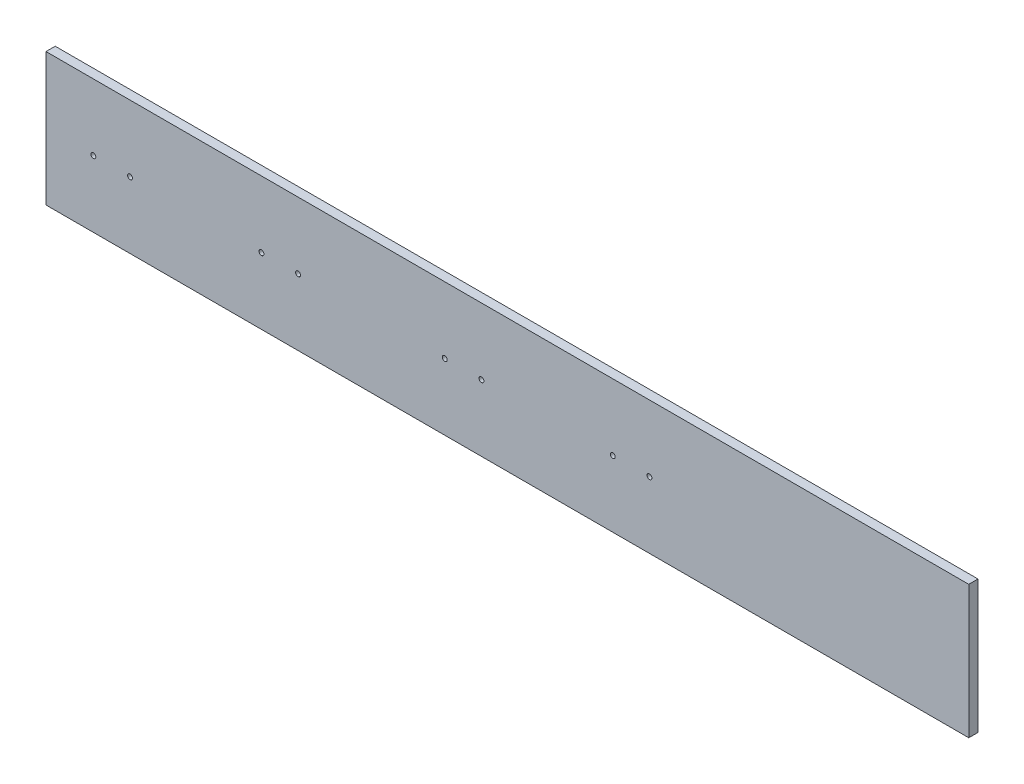
ISO-10303-21;
HEADER;
FILE_DESCRIPTION(('STEP AP214'),'2;1');
FILE_NAME('part.step','',(''),(''),'','','');
FILE_SCHEMA(('AUTOMOTIVE_DESIGN { 1 0 10303 214 1 1 1 1 }'));
ENDSEC;
DATA;
#1=APPLICATION_CONTEXT('core data for automotive mechanical design processes');
#2=APPLICATION_PROTOCOL_DEFINITION('international standard','automotive_design',2000,#1);
#3=PRODUCT_CONTEXT('',#1,'mechanical');
#4=PRODUCT('Part','Part','',(#3));
#5=PRODUCT_RELATED_PRODUCT_CATEGORY('part','',(#4));
#6=PRODUCT_DEFINITION_FORMATION('','',#4);
#7=PRODUCT_DEFINITION_CONTEXT('part definition',#1,'design');
#8=PRODUCT_DEFINITION('design','',#6,#7);
#9=PRODUCT_DEFINITION_SHAPE('','',#8);
#10=(LENGTH_UNIT() NAMED_UNIT(*) SI_UNIT(.MILLI.,.METRE.));
#11=(NAMED_UNIT(*) PLANE_ANGLE_UNIT() SI_UNIT($,.RADIAN.));
#12=(NAMED_UNIT(*) SI_UNIT($,.STERADIAN.) SOLID_ANGLE_UNIT());
#13=UNCERTAINTY_MEASURE_WITH_UNIT(LENGTH_MEASURE(1.E-05),#10,'distance_accuracy_value','');
#14=(GEOMETRIC_REPRESENTATION_CONTEXT(3) GLOBAL_UNCERTAINTY_ASSIGNED_CONTEXT((#13)) GLOBAL_UNIT_ASSIGNED_CONTEXT((#10,
#11,#12)) REPRESENTATION_CONTEXT('',''));
#15=CARTESIAN_POINT('',(0.,0.,0.));
#16=DIRECTION('',(0.,0.,1.));
#17=DIRECTION('',(1.,0.,0.));
#18=AXIS2_PLACEMENT_3D('',#15,#16,#17);
#19=CARTESIAN_POINT('',(126.125,-127.375,-0.046));
#20=DIRECTION('',(0.,0.,-1.));
#21=DIRECTION('',(0.,-1.,0.));
#22=AXIS2_PLACEMENT_3D('',#19,#20,#21);
#23=CYLINDRICAL_SURFACE('',#22,0.4);
#24=CARTESIAN_POINT('',(126.125,-127.375,0.));
#25=DIRECTION('',(0.,0.,-1.));
#26=DIRECTION('',(0.,-1.,0.));
#27=AXIS2_PLACEMENT_3D('',#24,#25,#26);
#28=CIRCLE('',#27,0.4);
#29=CARTESIAN_POINT('',(126.125,-127.775,0.));
#30=VERTEX_POINT('',#29);
#31=EDGE_CURVE('E226',#30,#30,#28,.T.);
#32=ORIENTED_EDGE('',*,*,#31,.T.);
#33=DIRECTION('',(0.,0.,1.));
#34=VECTOR('',#33,1.);
#35=CARTESIAN_POINT('',(126.125,-127.775,-0.046));
#36=LINE('',#35,#34);
#37=CARTESIAN_POINT('',(126.125,-127.775,1.51));
#38=VERTEX_POINT('',#37);
#39=EDGE_CURVE('E10',#30,#38,#36,.T.);
#40=ORIENTED_EDGE('',*,*,#39,.T.);
#41=CARTESIAN_POINT('',(126.125,-127.375,1.51));
#42=DIRECTION('',(0.,0.,-1.));
#43=DIRECTION('',(0.,-1.,0.));
#44=AXIS2_PLACEMENT_3D('',#41,#42,#43);
#45=CIRCLE('',#44,0.4);
#46=EDGE_CURVE('E258',#38,#38,#45,.T.);
#47=ORIENTED_EDGE('',*,*,#46,.F.);
#48=ORIENTED_EDGE('',*,*,#39,.F.);
#49=EDGE_LOOP('',(#32,#40,#47,#48));
#50=FACE_BOUND('',#49,.T.);
#51=ADVANCED_FACE('F16',(#50),#23,.F.);
#52=CARTESIAN_POINT('',(120.125,-127.375,-0.046));
#53=DIRECTION('',(0.,0.,-1.));
#54=DIRECTION('',(0.,-1.,0.));
#55=AXIS2_PLACEMENT_3D('',#52,#53,#54);
#56=CYLINDRICAL_SURFACE('',#55,0.4);
#57=CARTESIAN_POINT('',(120.125,-127.375,0.));
#58=DIRECTION('',(0.,0.,-1.));
#59=DIRECTION('',(0.,-1.,0.));
#60=AXIS2_PLACEMENT_3D('',#57,#58,#59);
#61=CIRCLE('',#60,0.4);
#62=CARTESIAN_POINT('',(120.125,-127.775,0.));
#63=VERTEX_POINT('',#62);
#64=EDGE_CURVE('E219',#63,#63,#61,.T.);
#65=ORIENTED_EDGE('',*,*,#64,.T.);
#66=DIRECTION('',(0.,0.,1.));
#67=VECTOR('',#66,1.);
#68=CARTESIAN_POINT('',(120.125,-127.775,-0.046));
#69=LINE('',#68,#67);
#70=CARTESIAN_POINT('',(120.125,-127.775,1.51));
#71=VERTEX_POINT('',#70);
#72=EDGE_CURVE('E24',#63,#71,#69,.T.);
#73=ORIENTED_EDGE('',*,*,#72,.T.);
#74=CARTESIAN_POINT('',(120.125,-127.375,1.51));
#75=DIRECTION('',(0.,0.,-1.));
#76=DIRECTION('',(0.,-1.,0.));
#77=AXIS2_PLACEMENT_3D('',#74,#75,#76);
#78=CIRCLE('',#77,0.4);
#79=EDGE_CURVE('E255',#71,#71,#78,.T.);
#80=ORIENTED_EDGE('',*,*,#79,.F.);
#81=ORIENTED_EDGE('',*,*,#72,.F.);
#82=EDGE_LOOP('',(#65,#73,#80,#81));
#83=FACE_BOUND('',#82,.T.);
#84=ADVANCED_FACE('F503',(#83),#56,.F.);
#85=CARTESIAN_POINT('',(96.125,-127.375,-0.046));
#86=DIRECTION('',(0.,0.,-1.));
#87=DIRECTION('',(0.,-1.,0.));
#88=AXIS2_PLACEMENT_3D('',#85,#86,#87);
#89=CYLINDRICAL_SURFACE('',#88,0.4);
#90=CARTESIAN_POINT('',(96.125,-127.375,0.));
#91=DIRECTION('',(0.,0.,-1.));
#92=DIRECTION('',(0.,-1.,0.));
#93=AXIS2_PLACEMENT_3D('',#90,#91,#92);
#94=CIRCLE('',#93,0.4);
#95=CARTESIAN_POINT('',(96.125,-127.775,0.));
#96=VERTEX_POINT('',#95);
#97=EDGE_CURVE('E215',#96,#96,#94,.T.);
#98=ORIENTED_EDGE('',*,*,#97,.T.);
#99=DIRECTION('',(0.,0.,1.));
#100=VECTOR('',#99,1.);
#101=CARTESIAN_POINT('',(96.125,-127.775,-0.046));
#102=LINE('',#101,#100);
#103=CARTESIAN_POINT('',(96.125,-127.775,1.51));
#104=VERTEX_POINT('',#103);
#105=EDGE_CURVE('E220',#96,#104,#102,.T.);
#106=ORIENTED_EDGE('',*,*,#105,.T.);
#107=CARTESIAN_POINT('',(96.125,-127.375,1.51));
#108=DIRECTION('',(0.,0.,-1.));
#109=DIRECTION('',(0.,-1.,0.));
#110=AXIS2_PLACEMENT_3D('',#107,#108,#109);
#111=CIRCLE('',#110,0.4);
#112=EDGE_CURVE('E251',#104,#104,#111,.T.);
#113=ORIENTED_EDGE('',*,*,#112,.F.);
#114=ORIENTED_EDGE('',*,*,#105,.F.);
#115=EDGE_LOOP('',(#98,#106,#113,#114));
#116=FACE_BOUND('',#115,.T.);
#117=ADVANCED_FACE('F492',(#116),#89,.F.);
#118=CARTESIAN_POINT('',(90.125,-127.375,-0.046));
#119=DIRECTION('',(0.,0.,-1.));
#120=DIRECTION('',(0.,-1.,0.));
#121=AXIS2_PLACEMENT_3D('',#118,#119,#120);
#122=CYLINDRICAL_SURFACE('',#121,0.4);
#123=CARTESIAN_POINT('',(90.125,-127.375,0.));
#124=DIRECTION('',(0.,0.,-1.));
#125=DIRECTION('',(0.,-1.,0.));
#126=AXIS2_PLACEMENT_3D('',#123,#124,#125);
#127=CIRCLE('',#126,0.4);
#128=CARTESIAN_POINT('',(90.125,-127.775,0.));
#129=VERTEX_POINT('',#128);
#130=EDGE_CURVE('E194',#129,#129,#127,.T.);
#131=ORIENTED_EDGE('',*,*,#130,.T.);
#132=DIRECTION('',(0.,0.,1.));
#133=VECTOR('',#132,1.);
#134=CARTESIAN_POINT('',(90.125,-127.775,-0.046));
#135=LINE('',#134,#133);
#136=CARTESIAN_POINT('',(90.125,-127.775,1.51));
#137=VERTEX_POINT('',#136);
#138=EDGE_CURVE('E223',#129,#137,#135,.T.);
#139=ORIENTED_EDGE('',*,*,#138,.T.);
#140=CARTESIAN_POINT('',(90.125,-127.375,1.51));
#141=DIRECTION('',(0.,0.,-1.));
#142=DIRECTION('',(0.,-1.,0.));
#143=AXIS2_PLACEMENT_3D('',#140,#141,#142);
#144=CIRCLE('',#143,0.4);
#145=EDGE_CURVE('E247',#137,#137,#144,.T.);
#146=ORIENTED_EDGE('',*,*,#145,.F.);
#147=ORIENTED_EDGE('',*,*,#138,.F.);
#148=EDGE_LOOP('',(#131,#139,#146,#147));
#149=FACE_BOUND('',#148,.T.);
#150=ADVANCED_FACE('F482',(#149),#122,.F.);
#151=CARTESIAN_POINT('',(68.625,-127.375,-0.046));
#152=DIRECTION('',(0.,0.,-1.));
#153=DIRECTION('',(0.,-1.,0.));
#154=AXIS2_PLACEMENT_3D('',#151,#152,#153);
#155=CYLINDRICAL_SURFACE('',#154,0.4);
#156=CARTESIAN_POINT('',(68.625,-127.375,0.));
#157=DIRECTION('',(0.,0.,-1.));
#158=DIRECTION('',(0.,-1.,0.));
#159=AXIS2_PLACEMENT_3D('',#156,#157,#158);
#160=CIRCLE('',#159,0.4);
#161=CARTESIAN_POINT('',(68.625,-127.775,0.));
#162=VERTEX_POINT('',#161);
#163=EDGE_CURVE('E190',#162,#162,#160,.T.);
#164=ORIENTED_EDGE('',*,*,#163,.T.);
#165=DIRECTION('',(0.,0.,1.));
#166=VECTOR('',#165,1.);
#167=CARTESIAN_POINT('',(68.625,-127.775,-0.046));
#168=LINE('',#167,#166);
#169=CARTESIAN_POINT('',(68.625,-127.775,1.51));
#170=VERTEX_POINT('',#169);
#171=EDGE_CURVE('E239',#162,#170,#168,.T.);
#172=ORIENTED_EDGE('',*,*,#171,.T.);
#173=CARTESIAN_POINT('',(68.625,-127.375,1.51));
#174=DIRECTION('',(0.,0.,-1.));
#175=DIRECTION('',(0.,-1.,0.));
#176=AXIS2_PLACEMENT_3D('',#173,#174,#175);
#177=CIRCLE('',#176,0.4);
#178=EDGE_CURVE('E210',#170,#170,#177,.T.);
#179=ORIENTED_EDGE('',*,*,#178,.F.);
#180=ORIENTED_EDGE('',*,*,#171,.F.);
#181=EDGE_LOOP('',(#164,#172,#179,#180));
#182=FACE_BOUND('',#181,.T.);
#183=ADVANCED_FACE('F471',(#182),#155,.F.);
#184=CARTESIAN_POINT('',(62.625,-127.375,-0.046));
#185=DIRECTION('',(0.,0.,-1.));
#186=DIRECTION('',(0.,-1.,0.));
#187=AXIS2_PLACEMENT_3D('',#184,#185,#186);
#188=CYLINDRICAL_SURFACE('',#187,0.4);
#189=CARTESIAN_POINT('',(62.625,-127.375,0.));
#190=DIRECTION('',(0.,0.,-1.));
#191=DIRECTION('',(0.,-1.,0.));
#192=AXIS2_PLACEMENT_3D('',#189,#190,#191);
#193=CIRCLE('',#192,0.4);
#194=CARTESIAN_POINT('',(62.625,-127.775,0.));
#195=VERTEX_POINT('',#194);
#196=EDGE_CURVE('E195',#195,#195,#193,.T.);
#197=ORIENTED_EDGE('',*,*,#196,.T.);
#198=DIRECTION('',(0.,0.,1.));
#199=VECTOR('',#198,1.);
#200=CARTESIAN_POINT('',(62.625,-127.775,-0.046));
#201=LINE('',#200,#199);
#202=CARTESIAN_POINT('',(62.625,-127.775,1.51));
#203=VERTEX_POINT('',#202);
#204=EDGE_CURVE('E236',#195,#203,#201,.T.);
#205=ORIENTED_EDGE('',*,*,#204,.T.);
#206=CARTESIAN_POINT('',(62.625,-127.375,1.51));
#207=DIRECTION('',(0.,0.,-1.));
#208=DIRECTION('',(0.,-1.,0.));
#209=AXIS2_PLACEMENT_3D('',#206,#207,#208);
#210=CIRCLE('',#209,0.4);
#211=EDGE_CURVE('E206',#203,#203,#210,.T.);
#212=ORIENTED_EDGE('',*,*,#211,.F.);
#213=ORIENTED_EDGE('',*,*,#204,.F.);
#214=EDGE_LOOP('',(#197,#205,#212,#213));
#215=FACE_BOUND('',#214,.T.);
#216=ADVANCED_FACE('F460',(#215),#188,.F.);
#217=CARTESIAN_POINT('',(153.625,-127.375,-0.046));
#218=DIRECTION('',(0.,0.,-1.));
#219=DIRECTION('',(0.,-1.,0.));
#220=AXIS2_PLACEMENT_3D('',#217,#218,#219);
#221=CYLINDRICAL_SURFACE('',#220,0.4);
#222=CARTESIAN_POINT('',(153.625,-127.375,0.));
#223=DIRECTION('',(0.,0.,-1.));
#224=DIRECTION('',(0.,-1.,0.));
#225=AXIS2_PLACEMENT_3D('',#222,#223,#224);
#226=CIRCLE('',#225,0.4);
#227=CARTESIAN_POINT('',(153.625,-127.775,0.));
#228=VERTEX_POINT('',#227);
#229=EDGE_CURVE('E175',#228,#228,#226,.T.);
#230=ORIENTED_EDGE('',*,*,#229,.T.);
#231=DIRECTION('',(0.,0.,1.));
#232=VECTOR('',#231,1.);
#233=CARTESIAN_POINT('',(153.625,-127.775,-0.046));
#234=LINE('',#233,#232);
#235=CARTESIAN_POINT('',(153.625,-127.775,1.51));
#236=VERTEX_POINT('',#235);
#237=EDGE_CURVE('E240',#228,#236,#234,.T.);
#238=ORIENTED_EDGE('',*,*,#237,.T.);
#239=CARTESIAN_POINT('',(153.625,-127.375,1.51));
#240=DIRECTION('',(0.,0.,-1.));
#241=DIRECTION('',(0.,-1.,0.));
#242=AXIS2_PLACEMENT_3D('',#239,#240,#241);
#243=CIRCLE('',#242,0.4);
#244=EDGE_CURVE('E211',#236,#236,#243,.T.);
#245=ORIENTED_EDGE('',*,*,#244,.F.);
#246=ORIENTED_EDGE('',*,*,#237,.F.);
#247=EDGE_LOOP('',(#230,#238,#245,#246));
#248=FACE_BOUND('',#247,.T.);
#249=ADVANCED_FACE('F449',(#248),#221,.F.);
#250=CARTESIAN_POINT('',(147.625,-127.375,-0.046));
#251=DIRECTION('',(0.,0.,-1.));
#252=DIRECTION('',(0.,-1.,0.));
#253=AXIS2_PLACEMENT_3D('',#250,#251,#252);
#254=CYLINDRICAL_SURFACE('',#253,0.4);
#255=CARTESIAN_POINT('',(147.625,-127.375,0.));
#256=DIRECTION('',(0.,0.,-1.));
#257=DIRECTION('',(0.,-1.,0.));
#258=AXIS2_PLACEMENT_3D('',#255,#256,#257);
#259=CIRCLE('',#258,0.4);
#260=CARTESIAN_POINT('',(147.625,-127.775,0.));
#261=VERTEX_POINT('',#260);
#262=EDGE_CURVE('E171',#261,#261,#259,.T.);
#263=ORIENTED_EDGE('',*,*,#262,.T.);
#264=DIRECTION('',(0.,0.,1.));
#265=VECTOR('',#264,1.);
#266=CARTESIAN_POINT('',(147.625,-127.775,-0.046));
#267=LINE('',#266,#265);
#268=CARTESIAN_POINT('',(147.625,-127.775,1.51));
#269=VERTEX_POINT('',#268);
#270=EDGE_CURVE('E261',#261,#269,#267,.T.);
#271=ORIENTED_EDGE('',*,*,#270,.T.);
#272=CARTESIAN_POINT('',(147.625,-127.375,1.51));
#273=DIRECTION('',(0.,0.,-1.));
#274=DIRECTION('',(0.,-1.,0.));
#275=AXIS2_PLACEMENT_3D('',#272,#273,#274);
#276=CIRCLE('',#275,0.4);
#277=EDGE_CURVE('E232',#269,#269,#276,.T.);
#278=ORIENTED_EDGE('',*,*,#277,.F.);
#279=ORIENTED_EDGE('',*,*,#270,.F.);
#280=EDGE_LOOP('',(#263,#271,#278,#279));
#281=FACE_BOUND('',#280,.T.);
#282=ADVANCED_FACE('F439',(#281),#254,.F.);
#283=CARTESIAN_POINT('',(54.875,-116.5,0.));
#284=DIRECTION('',(0.,1.,0.));
#285=DIRECTION('',(1.,0.,0.));
#286=AXIS2_PLACEMENT_3D('',#283,#284,#285);
#287=PLANE('',#286);
#288=DIRECTION('',(0.,0.,1.));
#289=VECTOR('',#288,1.);
#290=CARTESIAN_POINT('',(54.875,-116.5,0.));
#291=LINE('',#290,#289);
#292=CARTESIAN_POINT('',(54.875,-116.5,0.));
#293=VERTEX_POINT('',#292);
#294=CARTESIAN_POINT('',(54.875,-116.5,1.51));
#295=VERTEX_POINT('',#294);
#296=EDGE_CURVE('E183',#293,#295,#291,.T.);
#297=ORIENTED_EDGE('',*,*,#296,.T.);
#298=DIRECTION('',(1.,0.,0.));
#299=VECTOR('',#298,1.);
#300=CARTESIAN_POINT('',(54.875,-116.5,1.51));
#301=LINE('',#300,#299);
#302=CARTESIAN_POINT('',(205.875,-116.5,1.51));
#303=VERTEX_POINT('',#302);
#304=EDGE_CURVE('E229',#295,#303,#301,.T.);
#305=ORIENTED_EDGE('',*,*,#304,.T.);
#306=DIRECTION('',(0.,0.,1.));
#307=VECTOR('',#306,1.);
#308=CARTESIAN_POINT('',(205.875,-116.5,0.));
#309=LINE('',#308,#307);
#310=CARTESIAN_POINT('',(205.875,-116.5,0.));
#311=VERTEX_POINT('',#310);
#312=EDGE_CURVE('E157',#311,#303,#309,.T.);
#313=ORIENTED_EDGE('',*,*,#312,.F.);
#314=DIRECTION('',(1.,0.,0.));
#315=VECTOR('',#314,1.);
#316=CARTESIAN_POINT('',(54.875,-116.5,0.));
#317=LINE('',#316,#315);
#318=EDGE_CURVE('E140',#293,#311,#317,.T.);
#319=ORIENTED_EDGE('',*,*,#318,.F.);
#320=EDGE_LOOP('',(#297,#305,#313,#319));
#321=FACE_BOUND('',#320,.T.);
#322=ADVANCED_FACE('F428',(#321),#287,.T.);
#323=CARTESIAN_POINT('',(0.,0.,1.51));
#324=DIRECTION('',(0.,0.,1.));
#325=DIRECTION('',(1.,0.,0.));
#326=AXIS2_PLACEMENT_3D('',#323,#324,#325);
#327=PLANE('',#326);
#328=ORIENTED_EDGE('',*,*,#46,.T.);
#329=EDGE_LOOP('',(#328));
#330=FACE_BOUND('',#329,.T.);
#331=ORIENTED_EDGE('',*,*,#79,.T.);
#332=EDGE_LOOP('',(#331));
#333=FACE_BOUND('',#332,.T.);
#334=ORIENTED_EDGE('',*,*,#112,.T.);
#335=EDGE_LOOP('',(#334));
#336=FACE_BOUND('',#335,.T.);
#337=ORIENTED_EDGE('',*,*,#145,.T.);
#338=EDGE_LOOP('',(#337));
#339=FACE_BOUND('',#338,.T.);
#340=ORIENTED_EDGE('',*,*,#178,.T.);
#341=EDGE_LOOP('',(#340));
#342=FACE_BOUND('',#341,.T.);
#343=ORIENTED_EDGE('',*,*,#211,.T.);
#344=EDGE_LOOP('',(#343));
#345=FACE_BOUND('',#344,.T.);
#346=ORIENTED_EDGE('',*,*,#244,.T.);
#347=EDGE_LOOP('',(#346));
#348=FACE_BOUND('',#347,.T.);
#349=ORIENTED_EDGE('',*,*,#277,.T.);
#350=EDGE_LOOP('',(#349));
#351=FACE_BOUND('',#350,.T.);
#352=DIRECTION('',(-1.,0.,0.));
#353=VECTOR('',#352,1.);
#354=CARTESIAN_POINT('',(205.875,-138.25,1.51));
#355=LINE('',#354,#353);
#356=CARTESIAN_POINT('',(205.875,-138.25,1.51));
#357=VERTEX_POINT('',#356);
#358=CARTESIAN_POINT('',(54.875,-138.25,1.51));
#359=VERTEX_POINT('',#358);
#360=EDGE_CURVE('E163',#357,#359,#355,.T.);
#361=ORIENTED_EDGE('',*,*,#360,.F.);
#362=DIRECTION('',(0.,-1.,0.));
#363=VECTOR('',#362,1.);
#364=CARTESIAN_POINT('',(205.875,-116.5,1.51));
#365=LINE('',#364,#363);
#366=EDGE_CURVE('E147',#303,#357,#365,.T.);
#367=ORIENTED_EDGE('',*,*,#366,.F.);
#368=ORIENTED_EDGE('',*,*,#304,.F.);
#369=DIRECTION('',(0.,1.,0.));
#370=VECTOR('',#369,1.);
#371=CARTESIAN_POINT('',(54.875,-138.25,1.51));
#372=LINE('',#371,#370);
#373=EDGE_CURVE('E146',#359,#295,#372,.T.);
#374=ORIENTED_EDGE('',*,*,#373,.F.);
#375=EDGE_LOOP('',(#361,#367,#368,#374));
#376=FACE_BOUND('',#375,.T.);
#377=ADVANCED_FACE('F417',(#330,#333,#336,#339,#342,#345,#348,#351,#376),#327,.T.);
#378=CARTESIAN_POINT('',(0.,0.,0.));
#379=DIRECTION('',(0.,0.,1.));
#380=DIRECTION('',(1.,0.,0.));
#381=AXIS2_PLACEMENT_3D('',#378,#379,#380);
#382=PLANE('',#381);
#383=ORIENTED_EDGE('',*,*,#31,.F.);
#384=EDGE_LOOP('',(#383));
#385=FACE_BOUND('',#384,.T.);
#386=ORIENTED_EDGE('',*,*,#64,.F.);
#387=EDGE_LOOP('',(#386));
#388=FACE_BOUND('',#387,.T.);
#389=ORIENTED_EDGE('',*,*,#97,.F.);
#390=EDGE_LOOP('',(#389));
#391=FACE_BOUND('',#390,.T.);
#392=ORIENTED_EDGE('',*,*,#130,.F.);
#393=EDGE_LOOP('',(#392));
#394=FACE_BOUND('',#393,.T.);
#395=ORIENTED_EDGE('',*,*,#163,.F.);
#396=EDGE_LOOP('',(#395));
#397=FACE_BOUND('',#396,.T.);
#398=ORIENTED_EDGE('',*,*,#196,.F.);
#399=EDGE_LOOP('',(#398));
#400=FACE_BOUND('',#399,.T.);
#401=ORIENTED_EDGE('',*,*,#229,.F.);
#402=EDGE_LOOP('',(#401));
#403=FACE_BOUND('',#402,.T.);
#404=ORIENTED_EDGE('',*,*,#262,.F.);
#405=EDGE_LOOP('',(#404));
#406=FACE_BOUND('',#405,.T.);
#407=DIRECTION('',(0.,1.,0.));
#408=VECTOR('',#407,1.);
#409=CARTESIAN_POINT('',(54.875,-138.25,0.));
#410=LINE('',#409,#408);
#411=CARTESIAN_POINT('',(54.875,-138.25,0.));
#412=VERTEX_POINT('',#411);
#413=EDGE_CURVE('E189',#412,#293,#410,.T.);
#414=ORIENTED_EDGE('',*,*,#413,.T.);
#415=ORIENTED_EDGE('',*,*,#318,.T.);
#416=DIRECTION('',(0.,-1.,0.));
#417=VECTOR('',#416,1.);
#418=CARTESIAN_POINT('',(205.875,-116.5,0.));
#419=LINE('',#418,#417);
#420=CARTESIAN_POINT('',(205.875,-138.25,0.));
#421=VERTEX_POINT('',#420);
#422=EDGE_CURVE('E134',#311,#421,#419,.T.);
#423=ORIENTED_EDGE('',*,*,#422,.T.);
#424=DIRECTION('',(-1.,0.,0.));
#425=VECTOR('',#424,1.);
#426=CARTESIAN_POINT('',(205.875,-138.25,0.));
#427=LINE('',#426,#425);
#428=EDGE_CURVE('E138',#421,#412,#427,.T.);
#429=ORIENTED_EDGE('',*,*,#428,.T.);
#430=EDGE_LOOP('',(#414,#415,#423,#429));
#431=FACE_BOUND('',#430,.T.);
#432=ADVANCED_FACE('F137',(#385,#388,#391,#394,#397,#400,#403,#406,#431),#382,.F.);
#433=CARTESIAN_POINT('',(54.875,-138.25,0.));
#434=DIRECTION('',(-1.,0.,0.));
#435=DIRECTION('',(0.,0.,1.));
#436=AXIS2_PLACEMENT_3D('',#433,#434,#435);
#437=PLANE('',#436);
#438=DIRECTION('',(0.,0.,1.));
#439=VECTOR('',#438,1.);
#440=CARTESIAN_POINT('',(54.875,-138.25,0.));
#441=LINE('',#440,#439);
#442=EDGE_CURVE('E155',#412,#359,#441,.T.);
#443=ORIENTED_EDGE('',*,*,#442,.T.);
#444=ORIENTED_EDGE('',*,*,#373,.T.);
#445=ORIENTED_EDGE('',*,*,#296,.F.);
#446=ORIENTED_EDGE('',*,*,#413,.F.);
#447=EDGE_LOOP('',(#443,#444,#445,#446));
#448=FACE_BOUND('',#447,.T.);
#449=ADVANCED_FACE('F395',(#448),#437,.T.);
#450=CARTESIAN_POINT('',(205.875,-116.5,0.));
#451=DIRECTION('',(1.,0.,0.));
#452=DIRECTION('',(0.,1.,0.));
#453=AXIS2_PLACEMENT_3D('',#450,#451,#452);
#454=PLANE('',#453);
#455=ORIENTED_EDGE('',*,*,#312,.T.);
#456=ORIENTED_EDGE('',*,*,#366,.T.);
#457=DIRECTION('',(0.,0.,1.));
#458=VECTOR('',#457,1.);
#459=CARTESIAN_POINT('',(205.875,-138.25,0.));
#460=LINE('',#459,#458);
#461=EDGE_CURVE('E153',#421,#357,#460,.T.);
#462=ORIENTED_EDGE('',*,*,#461,.F.);
#463=ORIENTED_EDGE('',*,*,#422,.F.);
#464=EDGE_LOOP('',(#455,#456,#462,#463));
#465=FACE_BOUND('',#464,.T.);
#466=ADVANCED_FACE('F159',(#465),#454,.T.);
#467=CARTESIAN_POINT('',(205.875,-138.25,0.));
#468=DIRECTION('',(0.,-1.,0.));
#469=DIRECTION('',(0.,0.,-1.));
#470=AXIS2_PLACEMENT_3D('',#467,#468,#469);
#471=PLANE('',#470);
#472=ORIENTED_EDGE('',*,*,#461,.T.);
#473=ORIENTED_EDGE('',*,*,#360,.T.);
#474=ORIENTED_EDGE('',*,*,#442,.F.);
#475=ORIENTED_EDGE('',*,*,#428,.F.);
#476=EDGE_LOOP('',(#472,#473,#474,#475));
#477=FACE_BOUND('',#476,.T.);
#478=ADVANCED_FACE('F151',(#477),#471,.T.);
#479=CLOSED_SHELL('',(#51,#84,#117,#150,#183,#216,#249,#282,#322,#377,#432,#449,#466,#478));
#480=MANIFOLD_SOLID_BREP('B1',#479);
#481=ADVANCED_BREP_SHAPE_REPRESENTATION('',(#18,#480),#14);
#482=SHAPE_DEFINITION_REPRESENTATION(#9,#481);
ENDSEC;
END-ISO-10303-21;
